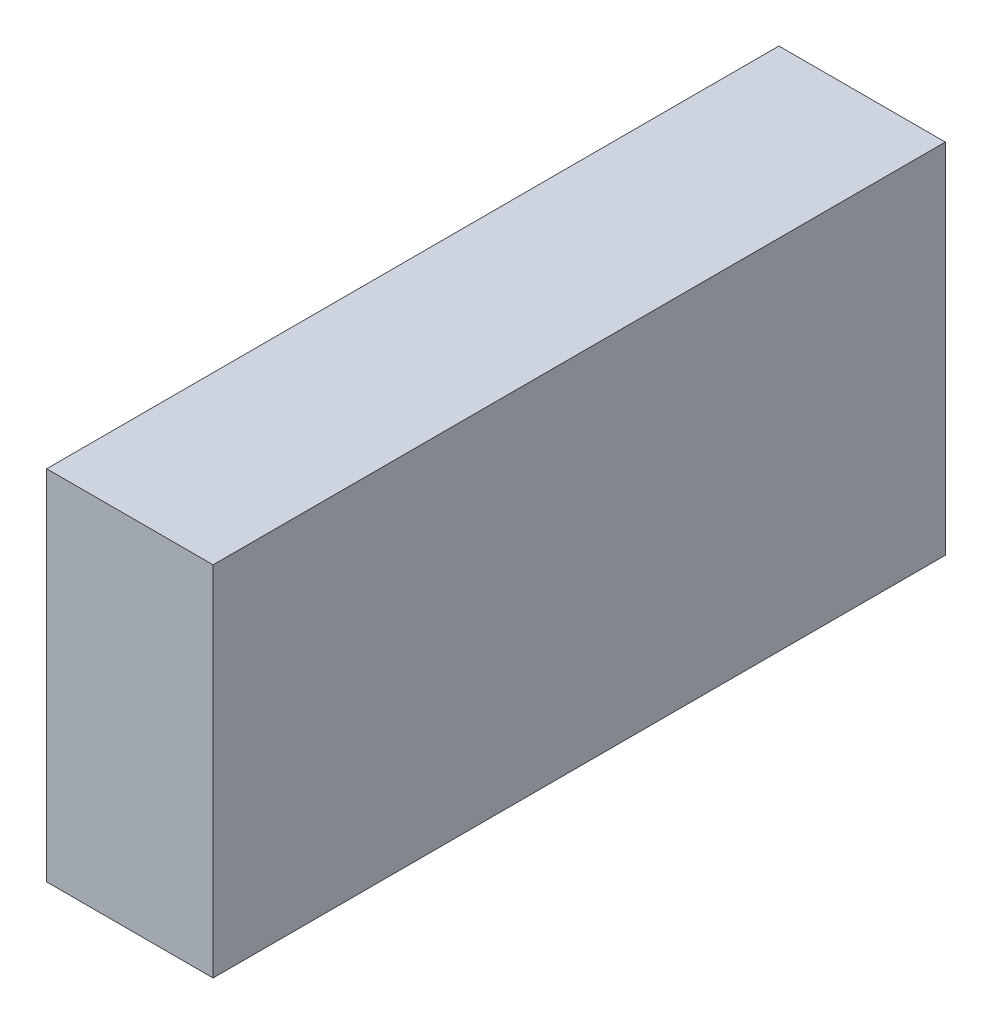
ISO-10303-21;
HEADER;
FILE_DESCRIPTION(('STEP AP214'),'2;1');
FILE_NAME('part.step','',(''),(''),'','','');
FILE_SCHEMA(('AUTOMOTIVE_DESIGN { 1 0 10303 214 1 1 1 1 }'));
ENDSEC;
DATA;
#1=APPLICATION_CONTEXT('core data for automotive mechanical design processes');
#2=APPLICATION_PROTOCOL_DEFINITION('international standard','automotive_design',2000,#1);
#3=PRODUCT_CONTEXT('',#1,'mechanical');
#4=PRODUCT('Part','Part','',(#3));
#5=PRODUCT_RELATED_PRODUCT_CATEGORY('part','',(#4));
#6=PRODUCT_DEFINITION_FORMATION('','',#4);
#7=PRODUCT_DEFINITION_CONTEXT('part definition',#1,'design');
#8=PRODUCT_DEFINITION('design','',#6,#7);
#9=PRODUCT_DEFINITION_SHAPE('','',#8);
#10=(LENGTH_UNIT() NAMED_UNIT(*) SI_UNIT(.MILLI.,.METRE.));
#11=(NAMED_UNIT(*) PLANE_ANGLE_UNIT() SI_UNIT($,.RADIAN.));
#12=(NAMED_UNIT(*) SI_UNIT($,.STERADIAN.) SOLID_ANGLE_UNIT());
#13=UNCERTAINTY_MEASURE_WITH_UNIT(LENGTH_MEASURE(1.E-05),#10,'distance_accuracy_value','');
#14=(GEOMETRIC_REPRESENTATION_CONTEXT(3) GLOBAL_UNCERTAINTY_ASSIGNED_CONTEXT((#13)) GLOBAL_UNIT_ASSIGNED_CONTEXT((#10,
#11,#12)) REPRESENTATION_CONTEXT('',''));
#15=CARTESIAN_POINT('',(0.,0.,0.));
#16=DIRECTION('',(0.,0.,1.));
#17=DIRECTION('',(1.,0.,0.));
#18=AXIS2_PLACEMENT_3D('',#15,#16,#17);
#19=CARTESIAN_POINT('',(-50.,215.,-220.));
#20=DIRECTION('',(0.,0.,1.));
#21=DIRECTION('',(1.,0.,0.));
#22=AXIS2_PLACEMENT_3D('',#19,#20,#21);
#23=PLANE('',#22);
#24=DIRECTION('',(-1.,0.,0.));
#25=VECTOR('',#24,1.);
#26=CARTESIAN_POINT('',(-50.,0.,-220.));
#27=LINE('',#26,#25);
#28=CARTESIAN_POINT('',(50.,0.,-220.));
#29=VERTEX_POINT('',#28);
#30=CARTESIAN_POINT('',(-50.,0.,-220.));
#31=VERTEX_POINT('',#30);
#32=EDGE_CURVE('E100',#29,#31,#27,.T.);
#33=ORIENTED_EDGE('',*,*,#32,.T.);
#34=DIRECTION('',(0.,-1.,0.));
#35=VECTOR('',#34,1.);
#36=CARTESIAN_POINT('',(-50.,215.,-220.));
#37=LINE('',#36,#35);
#38=CARTESIAN_POINT('',(-50.,215.,-220.));
#39=VERTEX_POINT('',#38);
#40=EDGE_CURVE('E11',#39,#31,#37,.T.);
#41=ORIENTED_EDGE('',*,*,#40,.F.);
#42=DIRECTION('',(-1.,0.,0.));
#43=VECTOR('',#42,1.);
#44=CARTESIAN_POINT('',(-50.,215.,-220.));
#45=LINE('',#44,#43);
#46=CARTESIAN_POINT('',(50.,215.,-220.));
#47=VERTEX_POINT('',#46);
#48=EDGE_CURVE('E88',#47,#39,#45,.T.);
#49=ORIENTED_EDGE('',*,*,#48,.F.);
#50=DIRECTION('',(0.,-1.,0.));
#51=VECTOR('',#50,1.);
#52=CARTESIAN_POINT('',(50.,215.,-220.));
#53=LINE('',#52,#51);
#54=EDGE_CURVE('E96',#47,#29,#53,.T.);
#55=ORIENTED_EDGE('',*,*,#54,.T.);
#56=EDGE_LOOP('',(#33,#41,#49,#55));
#57=FACE_BOUND('',#56,.T.);
#58=ADVANCED_FACE('F37',(#57),#23,.F.);
#59=CARTESIAN_POINT('',(-50.,215.,-220.));
#60=DIRECTION('',(1.,0.,0.));
#61=DIRECTION('',(0.,0.,-1.));
#62=AXIS2_PLACEMENT_3D('',#59,#60,#61);
#63=PLANE('',#62);
#64=DIRECTION('',(0.,0.,1.));
#65=VECTOR('',#64,1.);
#66=CARTESIAN_POINT('',(-50.,0.,-220.));
#67=LINE('',#66,#65);
#68=CARTESIAN_POINT('',(-50.,0.,220.));
#69=VERTEX_POINT('',#68);
#70=EDGE_CURVE('E92',#31,#69,#67,.T.);
#71=ORIENTED_EDGE('',*,*,#70,.T.);
#72=DIRECTION('',(0.,-1.,0.));
#73=VECTOR('',#72,1.);
#74=CARTESIAN_POINT('',(-50.,215.,220.));
#75=LINE('',#74,#73);
#76=CARTESIAN_POINT('',(-50.,215.,220.));
#77=VERTEX_POINT('',#76);
#78=EDGE_CURVE('E45',#77,#69,#75,.T.);
#79=ORIENTED_EDGE('',*,*,#78,.F.);
#80=DIRECTION('',(0.,0.,1.));
#81=VECTOR('',#80,1.);
#82=CARTESIAN_POINT('',(-50.,215.,-220.));
#83=LINE('',#82,#81);
#84=EDGE_CURVE('E83',#39,#77,#83,.T.);
#85=ORIENTED_EDGE('',*,*,#84,.F.);
#86=ORIENTED_EDGE('',*,*,#40,.T.);
#87=EDGE_LOOP('',(#71,#79,#85,#86));
#88=FACE_BOUND('',#87,.T.);
#89=ADVANCED_FACE('F91',(#88),#63,.F.);
#90=CARTESIAN_POINT('',(-50.,215.,220.));
#91=DIRECTION('',(0.,0.,-1.));
#92=DIRECTION('',(-1.,0.,0.));
#93=AXIS2_PLACEMENT_3D('',#90,#91,#92);
#94=PLANE('',#93);
#95=DIRECTION('',(1.,0.,0.));
#96=VECTOR('',#95,1.);
#97=CARTESIAN_POINT('',(-50.,0.,220.));
#98=LINE('',#97,#96);
#99=CARTESIAN_POINT('',(50.,0.,220.));
#100=VERTEX_POINT('',#99);
#101=EDGE_CURVE('E70',#69,#100,#98,.T.);
#102=ORIENTED_EDGE('',*,*,#101,.T.);
#103=DIRECTION('',(0.,-1.,0.));
#104=VECTOR('',#103,1.);
#105=CARTESIAN_POINT('',(50.,215.,220.));
#106=LINE('',#105,#104);
#107=CARTESIAN_POINT('',(50.,215.,220.));
#108=VERTEX_POINT('',#107);
#109=EDGE_CURVE('E93',#108,#100,#106,.T.);
#110=ORIENTED_EDGE('',*,*,#109,.F.);
#111=DIRECTION('',(1.,0.,0.));
#112=VECTOR('',#111,1.);
#113=CARTESIAN_POINT('',(-50.,215.,220.));
#114=LINE('',#113,#112);
#115=EDGE_CURVE('E86',#77,#108,#114,.T.);
#116=ORIENTED_EDGE('',*,*,#115,.F.);
#117=ORIENTED_EDGE('',*,*,#78,.T.);
#118=EDGE_LOOP('',(#102,#110,#116,#117));
#119=FACE_BOUND('',#118,.T.);
#120=ADVANCED_FACE('F94',(#119),#94,.F.);
#121=CARTESIAN_POINT('',(50.,215.,-220.));
#122=DIRECTION('',(-1.,0.,0.));
#123=DIRECTION('',(0.,0.,1.));
#124=AXIS2_PLACEMENT_3D('',#121,#122,#123);
#125=PLANE('',#124);
#126=DIRECTION('',(0.,0.,-1.));
#127=VECTOR('',#126,1.);
#128=CARTESIAN_POINT('',(50.,0.,-220.));
#129=LINE('',#128,#127);
#130=EDGE_CURVE('E76',#100,#29,#129,.T.);
#131=ORIENTED_EDGE('',*,*,#130,.T.);
#132=ORIENTED_EDGE('',*,*,#54,.F.);
#133=DIRECTION('',(0.,0.,-1.));
#134=VECTOR('',#133,1.);
#135=CARTESIAN_POINT('',(50.,215.,-220.));
#136=LINE('',#135,#134);
#137=EDGE_CURVE('E53',#108,#47,#136,.T.);
#138=ORIENTED_EDGE('',*,*,#137,.F.);
#139=ORIENTED_EDGE('',*,*,#109,.T.);
#140=EDGE_LOOP('',(#131,#132,#138,#139));
#141=FACE_BOUND('',#140,.T.);
#142=ADVANCED_FACE('F107',(#141),#125,.F.);
#143=CARTESIAN_POINT('',(0.,215.,0.));
#144=DIRECTION('',(0.,-1.,0.));
#145=DIRECTION('',(0.,0.,-1.));
#146=AXIS2_PLACEMENT_3D('',#143,#144,#145);
#147=PLANE('',#146);
#148=ORIENTED_EDGE('',*,*,#48,.T.);
#149=ORIENTED_EDGE('',*,*,#84,.T.);
#150=ORIENTED_EDGE('',*,*,#115,.T.);
#151=ORIENTED_EDGE('',*,*,#137,.T.);
#152=EDGE_LOOP('',(#148,#149,#150,#151));
#153=FACE_BOUND('',#152,.T.);
#154=ADVANCED_FACE('F84',(#153),#147,.F.);
#155=CARTESIAN_POINT('',(0.,0.,0.));
#156=DIRECTION('',(0.,-1.,0.));
#157=DIRECTION('',(0.,0.,-1.));
#158=AXIS2_PLACEMENT_3D('',#155,#156,#157);
#159=PLANE('',#158);
#160=ORIENTED_EDGE('',*,*,#32,.F.);
#161=ORIENTED_EDGE('',*,*,#130,.F.);
#162=ORIENTED_EDGE('',*,*,#101,.F.);
#163=ORIENTED_EDGE('',*,*,#70,.F.);
#164=EDGE_LOOP('',(#160,#161,#162,#163));
#165=FACE_BOUND('',#164,.T.);
#166=ADVANCED_FACE('F110',(#165),#159,.T.);
#167=CLOSED_SHELL('',(#58,#89,#120,#142,#154,#166));
#168=MANIFOLD_SOLID_BREP('B2',#167);
#169=ADVANCED_BREP_SHAPE_REPRESENTATION('',(#18,#168),#14);
#170=SHAPE_DEFINITION_REPRESENTATION(#9,#169);
ENDSEC;
END-ISO-10303-21;
